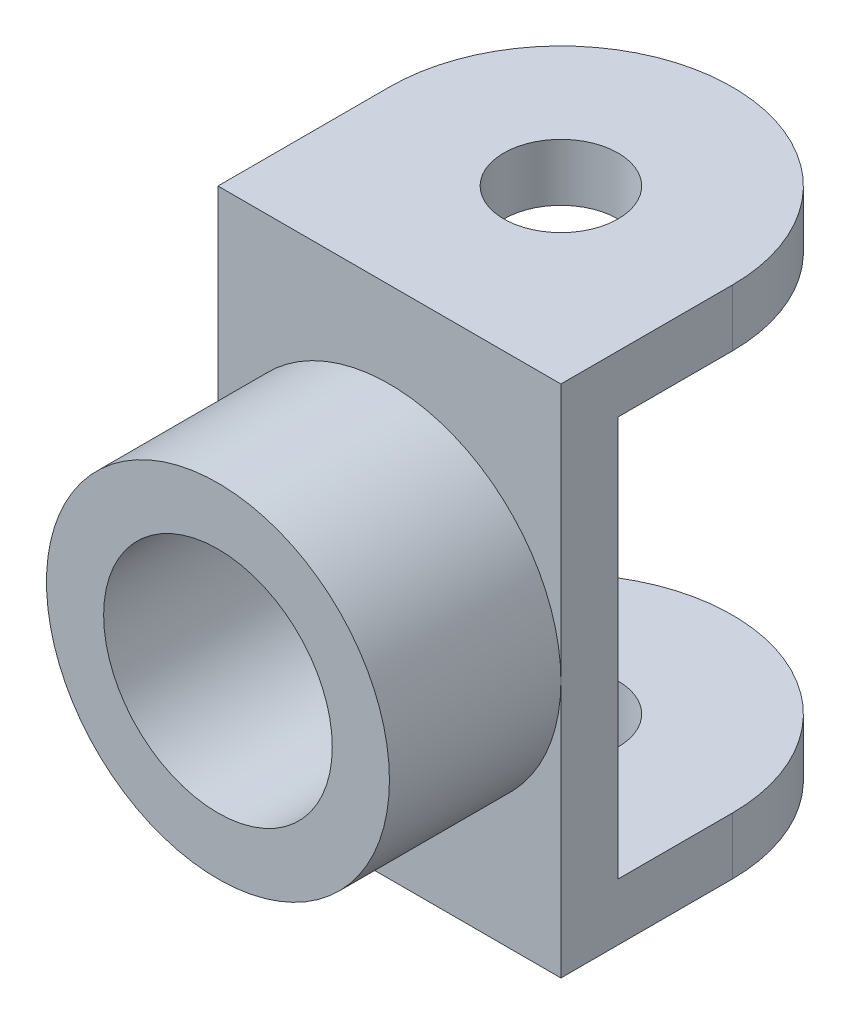
ISO-10303-21;
HEADER;
FILE_DESCRIPTION(('STEP AP214'),'2;1');
FILE_NAME('part.step','',(''),(''),'','','');
FILE_SCHEMA(('AUTOMOTIVE_DESIGN { 1 0 10303 214 1 1 1 1 }'));
ENDSEC;
DATA;
#1=APPLICATION_CONTEXT('core data for automotive mechanical design processes');
#2=APPLICATION_PROTOCOL_DEFINITION('international standard','automotive_design',2000,#1);
#3=PRODUCT_CONTEXT('',#1,'mechanical');
#4=PRODUCT('Part','Part','',(#3));
#5=PRODUCT_RELATED_PRODUCT_CATEGORY('part','',(#4));
#6=PRODUCT_DEFINITION_FORMATION('','',#4);
#7=PRODUCT_DEFINITION_CONTEXT('part definition',#1,'design');
#8=PRODUCT_DEFINITION('design','',#6,#7);
#9=PRODUCT_DEFINITION_SHAPE('','',#8);
#10=(LENGTH_UNIT() NAMED_UNIT(*) SI_UNIT(.MILLI.,.METRE.));
#11=(NAMED_UNIT(*) PLANE_ANGLE_UNIT() SI_UNIT($,.RADIAN.));
#12=(NAMED_UNIT(*) SI_UNIT($,.STERADIAN.) SOLID_ANGLE_UNIT());
#13=UNCERTAINTY_MEASURE_WITH_UNIT(LENGTH_MEASURE(1.E-05),#10,'distance_accuracy_value','');
#14=(GEOMETRIC_REPRESENTATION_CONTEXT(3) GLOBAL_UNCERTAINTY_ASSIGNED_CONTEXT((#13)) GLOBAL_UNIT_ASSIGNED_CONTEXT((#10,
#11,#12)) REPRESENTATION_CONTEXT('',''));
#15=CARTESIAN_POINT('',(0.,0.,0.));
#16=DIRECTION('',(0.,0.,1.));
#17=DIRECTION('',(1.,0.,0.));
#18=AXIS2_PLACEMENT_3D('',#15,#16,#17);
#19=CARTESIAN_POINT('',(0.,90.,0.));
#20=DIRECTION('',(0.,0.,1.));
#21=DIRECTION('',(1.,0.,0.));
#22=AXIS2_PLACEMENT_3D('',#19,#20,#21);
#23=PLANE('',#22);
#24=CARTESIAN_POINT('',(30.,45.,0.));
#25=DIRECTION('',(0.,0.,1.));
#26=DIRECTION('',(1.,0.,0.));
#27=AXIS2_PLACEMENT_3D('',#24,#25,#26);
#28=CIRCLE('',#27,30.);
#29=CARTESIAN_POINT('',(60.,45.,0.));
#30=VERTEX_POINT('',#29);
#31=CARTESIAN_POINT('',(0.,45.,0.));
#32=VERTEX_POINT('',#31);
#33=EDGE_CURVE('E47',#30,#32,#28,.T.);
#34=ORIENTED_EDGE('',*,*,#33,.F.);
#35=DIRECTION('',(0.,-1.,0.));
#36=VECTOR('',#35,1.);
#37=CARTESIAN_POINT('',(60.,90.,0.));
#38=LINE('',#37,#36);
#39=CARTESIAN_POINT('',(60.,90.,0.));
#40=VERTEX_POINT('',#39);
#41=EDGE_CURVE('E108',#40,#30,#38,.T.);
#42=ORIENTED_EDGE('',*,*,#41,.F.);
#43=DIRECTION('',(-1.,0.,0.));
#44=VECTOR('',#43,1.);
#45=CARTESIAN_POINT('',(0.,90.,0.));
#46=LINE('',#45,#44);
#47=CARTESIAN_POINT('',(0.,90.,0.));
#48=VERTEX_POINT('',#47);
#49=EDGE_CURVE('E205',#40,#48,#46,.T.);
#50=ORIENTED_EDGE('',*,*,#49,.T.);
#51=DIRECTION('',(0.,-1.,0.));
#52=VECTOR('',#51,1.);
#53=CARTESIAN_POINT('',(0.,90.,0.));
#54=LINE('',#53,#52);
#55=EDGE_CURVE('E129',#48,#32,#54,.T.);
#56=ORIENTED_EDGE('',*,*,#55,.T.);
#57=EDGE_LOOP('',(#34,#42,#50,#56));
#58=FACE_BOUND('',#57,.T.);
#59=ADVANCED_FACE('F37',(#58),#23,.T.);
#60=CARTESIAN_POINT('',(30.,90.,-30.));
#61=DIRECTION('',(0.,-1.,0.));
#62=DIRECTION('',(0.,0.,-1.));
#63=AXIS2_PLACEMENT_3D('',#60,#61,#62);
#64=CYLINDRICAL_SURFACE('',#63,30.);
#65=DIRECTION('',(0.,-1.,0.));
#66=VECTOR('',#65,1.);
#67=CARTESIAN_POINT('',(60.,90.,-30.));
#68=LINE('',#67,#66);
#69=CARTESIAN_POINT('',(60.,90.,-30.));
#70=VERTEX_POINT('',#69);
#71=CARTESIAN_POINT('',(60.,80.,-30.));
#72=VERTEX_POINT('',#71);
#73=EDGE_CURVE('E126',#70,#72,#68,.T.);
#74=ORIENTED_EDGE('',*,*,#73,.T.);
#75=CARTESIAN_POINT('',(30.,80.,-30.));
#76=DIRECTION('',(0.,1.,0.));
#77=DIRECTION('',(0.,0.,1.));
#78=AXIS2_PLACEMENT_3D('',#75,#76,#77);
#79=CIRCLE('',#78,30.);
#80=CARTESIAN_POINT('',(0.,80.,-30.));
#81=VERTEX_POINT('',#80);
#82=EDGE_CURVE('E188',#72,#81,#79,.T.);
#83=ORIENTED_EDGE('',*,*,#82,.T.);
#84=DIRECTION('',(0.,-1.,0.));
#85=VECTOR('',#84,1.);
#86=CARTESIAN_POINT('',(0.,90.,-30.));
#87=LINE('',#86,#85);
#88=CARTESIAN_POINT('',(0.,90.,-30.));
#89=VERTEX_POINT('',#88);
#90=EDGE_CURVE('E184',#89,#81,#87,.T.);
#91=ORIENTED_EDGE('',*,*,#90,.F.);
#92=CARTESIAN_POINT('',(30.,90.,-30.));
#93=DIRECTION('',(0.,1.,0.));
#94=DIRECTION('',(0.,0.,1.));
#95=AXIS2_PLACEMENT_3D('',#92,#93,#94);
#96=CIRCLE('',#95,30.);
#97=EDGE_CURVE('E200',#70,#89,#96,.T.);
#98=ORIENTED_EDGE('',*,*,#97,.F.);
#99=EDGE_LOOP('',(#74,#83,#91,#98));
#100=FACE_BOUND('',#99,.T.);
#101=ADVANCED_FACE('F152',(#100),#64,.T.);
#102=CARTESIAN_POINT('',(30.,90.,-30.));
#103=DIRECTION('',(0.,-1.,0.));
#104=DIRECTION('',(0.,0.,-1.));
#105=AXIS2_PLACEMENT_3D('',#102,#103,#104);
#106=CYLINDRICAL_SURFACE('',#105,10.);
#107=CARTESIAN_POINT('',(30.,80.,-30.));
#108=DIRECTION('',(0.,1.,0.));
#109=DIRECTION('',(0.,0.,1.));
#110=AXIS2_PLACEMENT_3D('',#107,#108,#109);
#111=CIRCLE('',#110,10.);
#112=CARTESIAN_POINT('',(30.,80.,-40.));
#113=VERTEX_POINT('',#112);
#114=EDGE_CURVE('E187',#113,#113,#111,.T.);
#115=CARTESIAN_POINT('',(30.,90.,-30.));
#116=DIRECTION('',(0.,1.,0.));
#117=DIRECTION('',(0.,0.,1.));
#118=AXIS2_PLACEMENT_3D('',#115,#116,#117);
#119=CIRCLE('',#118,10.);
#120=CARTESIAN_POINT('',(30.,90.,-40.));
#121=VERTEX_POINT('',#120);
#122=EDGE_CURVE('E197',#121,#121,#119,.T.);
#123=CARTESIAN_POINT('',(30.,80.,-40.));
#124=CARTESIAN_POINT('',(30.,80.1041666666667,-40.));
#125=CARTESIAN_POINT('',(30.,80.2083333333333,-40.));
#126=CARTESIAN_POINT('',(30.,80.4166666666667,-40.));
#127=CARTESIAN_POINT('',(30.,80.5208333333333,-40.));
#128=CARTESIAN_POINT('',(30.,80.7291666666667,-40.));
#129=CARTESIAN_POINT('',(30.,80.8333333333333,-40.));
#130=CARTESIAN_POINT('',(30.,81.0416666666667,-40.));
#131=CARTESIAN_POINT('',(30.,81.1458333333333,-40.));
#132=CARTESIAN_POINT('',(30.,81.3541666666667,-40.));
#133=CARTESIAN_POINT('',(30.,81.4583333333333,-40.));
#134=CARTESIAN_POINT('',(30.,81.6666666666667,-40.));
#135=CARTESIAN_POINT('',(30.,81.7708333333333,-40.));
#136=CARTESIAN_POINT('',(30.,81.9791666666667,-40.));
#137=CARTESIAN_POINT('',(30.,82.0833333333333,-40.));
#138=CARTESIAN_POINT('',(30.,82.2916666666667,-40.));
#139=CARTESIAN_POINT('',(30.,82.3958333333333,-40.));
#140=CARTESIAN_POINT('',(30.,82.6041666666667,-40.));
#141=CARTESIAN_POINT('',(30.,82.7083333333333,-40.));
#142=CARTESIAN_POINT('',(30.,82.9166666666667,-40.));
#143=CARTESIAN_POINT('',(30.,83.0208333333333,-40.));
#144=CARTESIAN_POINT('',(30.,83.2291666666667,-40.));
#145=CARTESIAN_POINT('',(30.,83.3333333333333,-40.));
#146=CARTESIAN_POINT('',(30.,83.5416666666667,-40.));
#147=CARTESIAN_POINT('',(30.,83.6458333333333,-40.));
#148=CARTESIAN_POINT('',(30.,83.8541666666667,-40.));
#149=CARTESIAN_POINT('',(30.,83.9583333333333,-40.));
#150=CARTESIAN_POINT('',(30.,84.1666666666667,-40.));
#151=CARTESIAN_POINT('',(30.,84.2708333333333,-40.));
#152=CARTESIAN_POINT('',(30.,84.4791666666667,-40.));
#153=CARTESIAN_POINT('',(30.,84.5833333333333,-40.));
#154=CARTESIAN_POINT('',(30.,84.7916666666667,-40.));
#155=CARTESIAN_POINT('',(30.,84.8958333333333,-40.));
#156=CARTESIAN_POINT('',(30.,85.1041666666667,-40.));
#157=CARTESIAN_POINT('',(30.,85.2083333333333,-40.));
#158=CARTESIAN_POINT('',(30.,85.4166666666667,-40.));
#159=CARTESIAN_POINT('',(30.,85.5208333333333,-40.));
#160=CARTESIAN_POINT('',(30.,85.7291666666667,-40.));
#161=CARTESIAN_POINT('',(30.,85.8333333333333,-40.));
#162=CARTESIAN_POINT('',(30.,86.0416666666667,-40.));
#163=CARTESIAN_POINT('',(30.,86.1458333333333,-40.));
#164=CARTESIAN_POINT('',(30.,86.3541666666667,-40.));
#165=CARTESIAN_POINT('',(30.,86.4583333333333,-40.));
#166=CARTESIAN_POINT('',(30.,86.6666666666667,-40.));
#167=CARTESIAN_POINT('',(30.,86.7708333333333,-40.));
#168=CARTESIAN_POINT('',(30.,86.9791666666667,-40.));
#169=CARTESIAN_POINT('',(30.,87.0833333333333,-40.));
#170=CARTESIAN_POINT('',(30.,87.2916666666667,-40.));
#171=CARTESIAN_POINT('',(30.,87.3958333333333,-40.));
#172=CARTESIAN_POINT('',(30.,87.6041666666667,-40.));
#173=CARTESIAN_POINT('',(30.,87.7083333333333,-40.));
#174=CARTESIAN_POINT('',(30.,87.9166666666667,-40.));
#175=CARTESIAN_POINT('',(30.,88.0208333333333,-40.));
#176=CARTESIAN_POINT('',(30.,88.2291666666667,-40.));
#177=CARTESIAN_POINT('',(30.,88.3333333333333,-40.));
#178=CARTESIAN_POINT('',(30.,88.5416666666667,-40.));
#179=CARTESIAN_POINT('',(30.,88.6458333333333,-40.));
#180=CARTESIAN_POINT('',(30.,88.8541666666667,-40.));
#181=CARTESIAN_POINT('',(30.,88.9583333333333,-40.));
#182=CARTESIAN_POINT('',(30.,89.1666666666667,-40.));
#183=CARTESIAN_POINT('',(30.,89.2708333333333,-40.));
#184=CARTESIAN_POINT('',(30.,89.4791666666667,-40.));
#185=CARTESIAN_POINT('',(30.,89.5833333333333,-40.));
#186=CARTESIAN_POINT('',(30.,89.7916666666667,-40.));
#187=CARTESIAN_POINT('',(30.,89.8958333333333,-40.));
#188=CARTESIAN_POINT('',(30.,90.,-40.));
#189=B_SPLINE_CURVE_WITH_KNOTS('',3,(#123,#124,#125,#126,#127,#128,#129,#130,#131,#132,#133,
#134,#135,#136,#137,#138,#139,#140,#141,#142,#143,#144,#145,#146,#147,#148,#149,#150,#151,#152,
#153,#154,#155,#156,#157,#158,#159,#160,#161,#162,#163,#164,#165,#166,#167,#168,#169,#170,#171,
#172,#173,#174,#175,#176,#177,#178,#179,#180,#181,#182,#183,#184,#185,#186,#187,#188),
.UNSPECIFIED.,.F.,.F.,(4,2,2,2,2,2,2,2,2,2,2,2,2,2,2,2,2,2,2,2,2,2,2,2,2,2,2,2,2,2,2,2,4),(0.,
0.312499999999993,0.625000000000001,0.937499999999994,1.24999999999999,1.56249999999999,
1.87499999999999,2.1875,2.49999999999999,2.8125,3.12499999999999,3.4375,3.74999999999999,4.0625,
4.37499999999999,4.6875,4.99999999999999,5.3125,5.62499999999999,5.93749999999998,
6.24999999999999,6.56249999999998,6.87499999999999,7.18749999999999,7.49999999999999,
7.81249999999999,8.12499999999999,8.43749999999999,8.74999999999999,9.06249999999999,
9.37499999999999,9.68749999999999,9.99999999999999),.UNSPECIFIED.);
#190=EDGE_CURVE('BSEAM157',#113,#121,#189,.T.);
#191=ORIENTED_EDGE('',*,*,#114,.F.);
#192=ORIENTED_EDGE('',*,*,#122,.T.);
#193=ORIENTED_EDGE('',*,*,#190,.T.);
#194=ORIENTED_EDGE('',*,*,#190,.F.);
#195=EDGE_LOOP('',(#191,#193,#192,#194));
#196=FACE_BOUND('',#195,.T.);
#197=ADVANCED_FACE('F157',(#196),#106,.F.);
#198=CARTESIAN_POINT('',(0.,9.99999999999999,-30.));
#199=VERTEX_POINT('',#198);
#200=CARTESIAN_POINT('',(0.,0.,-30.));
#201=VERTEX_POINT('',#200);
#202=EDGE_CURVE('E222',#199,#201,#87,.T.);
#203=ORIENTED_EDGE('',*,*,#202,.F.);
#204=CARTESIAN_POINT('',(30.,9.99999999999999,-30.));
#205=DIRECTION('',(0.,-1.,0.));
#206=DIRECTION('',(0.,0.,-1.));
#207=AXIS2_PLACEMENT_3D('',#204,#205,#206);
#208=CIRCLE('',#207,30.);
#209=CARTESIAN_POINT('',(60.,9.99999999999999,-30.));
#210=VERTEX_POINT('',#209);
#211=EDGE_CURVE('E238',#199,#210,#208,.T.);
#212=ORIENTED_EDGE('',*,*,#211,.T.);
#213=CARTESIAN_POINT('',(60.,0.,-30.));
#214=VERTEX_POINT('',#213);
#215=EDGE_CURVE('E208',#210,#214,#68,.T.);
#216=ORIENTED_EDGE('',*,*,#215,.T.);
#217=CARTESIAN_POINT('',(30.,0.,-30.));
#218=DIRECTION('',(0.,1.,0.));
#219=DIRECTION('',(0.,0.,1.));
#220=AXIS2_PLACEMENT_3D('',#217,#218,#219);
#221=CIRCLE('',#220,30.);
#222=EDGE_CURVE('E211',#214,#201,#221,.T.);
#223=ORIENTED_EDGE('',*,*,#222,.T.);
#224=EDGE_LOOP('',(#203,#212,#216,#223));
#225=FACE_BOUND('',#224,.T.);
#226=ADVANCED_FACE('F159',(#225),#64,.T.);
#227=CARTESIAN_POINT('',(0.,90.,0.));
#228=DIRECTION('',(-1.,0.,0.));
#229=DIRECTION('',(0.,0.,1.));
#230=AXIS2_PLACEMENT_3D('',#227,#228,#229);
#231=PLANE('',#230);
#232=DIRECTION('',(0.,0.,-1.));
#233=VECTOR('',#232,1.);
#234=CARTESIAN_POINT('',(0.,80.,0.));
#235=LINE('',#234,#233);
#236=CARTESIAN_POINT('',(0.,80.,-10.));
#237=VERTEX_POINT('',#236);
#238=EDGE_CURVE('E179',#237,#81,#235,.T.);
#239=ORIENTED_EDGE('',*,*,#238,.F.);
#240=DIRECTION('',(0.,1.,0.));
#241=VECTOR('',#240,1.);
#242=CARTESIAN_POINT('',(0.,90.,-10.));
#243=LINE('',#242,#241);
#244=CARTESIAN_POINT('',(0.,9.99999999999999,-10.));
#245=VERTEX_POINT('',#244);
#246=EDGE_CURVE('E181',#245,#237,#243,.T.);
#247=ORIENTED_EDGE('',*,*,#246,.F.);
#248=DIRECTION('',(0.,0.,1.));
#249=VECTOR('',#248,1.);
#250=CARTESIAN_POINT('',(0.,9.99999999999999,0.));
#251=LINE('',#250,#249);
#252=EDGE_CURVE('E236',#199,#245,#251,.T.);
#253=ORIENTED_EDGE('',*,*,#252,.F.);
#254=ORIENTED_EDGE('',*,*,#202,.T.);
#255=DIRECTION('',(0.,0.,-1.));
#256=VECTOR('',#255,1.);
#257=CARTESIAN_POINT('',(0.,0.,0.));
#258=LINE('',#257,#256);
#259=CARTESIAN_POINT('',(0.,0.,0.));
#260=VERTEX_POINT('',#259);
#261=EDGE_CURVE('E214',#260,#201,#258,.T.);
#262=ORIENTED_EDGE('',*,*,#261,.F.);
#263=EDGE_CURVE('E120',#32,#260,#54,.T.);
#264=ORIENTED_EDGE('',*,*,#263,.F.);
#265=ORIENTED_EDGE('',*,*,#55,.F.);
#266=DIRECTION('',(0.,0.,-1.));
#267=VECTOR('',#266,1.);
#268=CARTESIAN_POINT('',(0.,90.,0.));
#269=LINE('',#268,#267);
#270=EDGE_CURVE('E203',#48,#89,#269,.T.);
#271=ORIENTED_EDGE('',*,*,#270,.T.);
#272=ORIENTED_EDGE('',*,*,#90,.T.);
#273=EDGE_LOOP('',(#239,#247,#253,#254,#262,#264,#265,#271,#272));
#274=FACE_BOUND('',#273,.T.);
#275=ADVANCED_FACE('F165',(#274),#231,.T.);
#276=EDGE_CURVE('E11',#32,#30,#28,.T.);
#277=ORIENTED_EDGE('',*,*,#276,.F.);
#278=ORIENTED_EDGE('',*,*,#263,.T.);
#279=DIRECTION('',(-1.,0.,0.));
#280=VECTOR('',#279,1.);
#281=CARTESIAN_POINT('',(0.,0.,0.));
#282=LINE('',#281,#280);
#283=CARTESIAN_POINT('',(60.,0.,0.));
#284=VERTEX_POINT('',#283);
#285=EDGE_CURVE('E124',#284,#260,#282,.T.);
#286=ORIENTED_EDGE('',*,*,#285,.F.);
#287=EDGE_CURVE('E112',#30,#284,#38,.T.);
#288=ORIENTED_EDGE('',*,*,#287,.F.);
#289=EDGE_LOOP('',(#277,#278,#286,#288));
#290=FACE_BOUND('',#289,.T.);
#291=ADVANCED_FACE('F122',(#290),#23,.T.);
#292=CARTESIAN_POINT('',(30.,9.99999999999999,-30.));
#293=DIRECTION('',(0.,-1.,0.));
#294=DIRECTION('',(0.,0.,-1.));
#295=AXIS2_PLACEMENT_3D('',#292,#293,#294);
#296=CIRCLE('',#295,10.);
#297=CARTESIAN_POINT('',(30.,9.99999999999999,-40.));
#298=VERTEX_POINT('',#297);
#299=EDGE_CURVE('E193',#298,#298,#296,.T.);
#300=CARTESIAN_POINT('',(30.,0.,-30.));
#301=DIRECTION('',(0.,1.,0.));
#302=DIRECTION('',(0.,0.,1.));
#303=AXIS2_PLACEMENT_3D('',#300,#301,#302);
#304=CIRCLE('',#303,10.);
#305=CARTESIAN_POINT('',(30.,0.,-40.));
#306=VERTEX_POINT('',#305);
#307=EDGE_CURVE('E191',#306,#306,#304,.T.);
#308=CARTESIAN_POINT('',(30.,9.99999999999999,-40.));
#309=CARTESIAN_POINT('',(30.,9.89583333333333,-40.));
#310=CARTESIAN_POINT('',(30.,9.79166666666667,-40.));
#311=CARTESIAN_POINT('',(30.,9.58333333333333,-40.));
#312=CARTESIAN_POINT('',(30.,9.47916666666666,-40.));
#313=CARTESIAN_POINT('',(30.,9.27083333333333,-40.));
#314=CARTESIAN_POINT('',(30.,9.16666666666666,-40.));
#315=CARTESIAN_POINT('',(30.,8.95833333333332,-40.));
#316=CARTESIAN_POINT('',(30.,8.85416666666666,-40.));
#317=CARTESIAN_POINT('',(30.,8.64583333333333,-40.));
#318=CARTESIAN_POINT('',(30.,8.54166666666666,-40.));
#319=CARTESIAN_POINT('',(30.,8.33333333333333,-40.));
#320=CARTESIAN_POINT('',(30.,8.22916666666666,-40.));
#321=CARTESIAN_POINT('',(30.,8.02083333333333,-40.));
#322=CARTESIAN_POINT('',(30.,7.91666666666666,-40.));
#323=CARTESIAN_POINT('',(30.,7.70833333333332,-40.));
#324=CARTESIAN_POINT('',(30.,7.60416666666666,-40.));
#325=CARTESIAN_POINT('',(30.,7.39583333333333,-40.));
#326=CARTESIAN_POINT('',(30.,7.29166666666666,-40.));
#327=CARTESIAN_POINT('',(30.,7.08333333333333,-40.));
#328=CARTESIAN_POINT('',(30.,6.97916666666666,-40.));
#329=CARTESIAN_POINT('',(30.,6.77083333333332,-40.));
#330=CARTESIAN_POINT('',(30.,6.66666666666665,-40.));
#331=CARTESIAN_POINT('',(30.,6.45833333333332,-40.));
#332=CARTESIAN_POINT('',(30.,6.35416666666666,-40.));
#333=CARTESIAN_POINT('',(30.,6.14583333333333,-40.));
#334=CARTESIAN_POINT('',(30.,6.04166666666666,-40.));
#335=CARTESIAN_POINT('',(30.,5.83333333333333,-40.));
#336=CARTESIAN_POINT('',(30.,5.72916666666666,-40.));
#337=CARTESIAN_POINT('',(30.,5.52083333333332,-40.));
#338=CARTESIAN_POINT('',(30.,5.41666666666665,-40.));
#339=CARTESIAN_POINT('',(30.,5.20833333333332,-40.));
#340=CARTESIAN_POINT('',(30.,5.10416666666666,-40.));
#341=CARTESIAN_POINT('',(30.,4.89583333333333,-40.));
#342=CARTESIAN_POINT('',(30.,4.79166666666666,-40.));
#343=CARTESIAN_POINT('',(30.,4.58333333333333,-40.));
#344=CARTESIAN_POINT('',(30.,4.47916666666666,-40.));
#345=CARTESIAN_POINT('',(30.,4.27083333333332,-40.));
#346=CARTESIAN_POINT('',(30.,4.16666666666665,-40.));
#347=CARTESIAN_POINT('',(30.,3.95833333333332,-40.));
#348=CARTESIAN_POINT('',(30.,3.85416666666665,-40.));
#349=CARTESIAN_POINT('',(30.,3.64583333333333,-40.));
#350=CARTESIAN_POINT('',(30.,3.54166666666666,-40.));
#351=CARTESIAN_POINT('',(30.,3.33333333333333,-40.));
#352=CARTESIAN_POINT('',(30.,3.22916666666666,-40.));
#353=CARTESIAN_POINT('',(30.,3.02083333333332,-40.));
#354=CARTESIAN_POINT('',(30.,2.91666666666665,-40.));
#355=CARTESIAN_POINT('',(30.,2.70833333333332,-40.));
#356=CARTESIAN_POINT('',(30.,2.60416666666665,-40.));
#357=CARTESIAN_POINT('',(30.,2.39583333333332,-40.));
#358=CARTESIAN_POINT('',(30.,2.29166666666666,-40.));
#359=CARTESIAN_POINT('',(30.,2.08333333333333,-40.));
#360=CARTESIAN_POINT('',(30.,1.97916666666666,-40.));
#361=CARTESIAN_POINT('',(30.,1.77083333333332,-40.));
#362=CARTESIAN_POINT('',(30.,1.66666666666665,-40.));
#363=CARTESIAN_POINT('',(30.,1.45833333333332,-40.));
#364=CARTESIAN_POINT('',(30.,1.35416666666665,-40.));
#365=CARTESIAN_POINT('',(30.,1.14583333333332,-40.));
#366=CARTESIAN_POINT('',(30.,1.04166666666666,-40.));
#367=CARTESIAN_POINT('',(30.,0.833333333333325,-40.));
#368=CARTESIAN_POINT('',(30.,0.729166666666656,-40.));
#369=CARTESIAN_POINT('',(30.,0.520833333333318,-40.));
#370=CARTESIAN_POINT('',(30.,0.416666666666649,-40.));
#371=CARTESIAN_POINT('',(30.,0.208333333333315,-40.));
#372=CARTESIAN_POINT('',(30.,0.10416666666665,-40.));
#373=CARTESIAN_POINT('',(30.,0.,-40.));
#374=B_SPLINE_CURVE_WITH_KNOTS('',3,(#308,#309,#310,#311,#312,#313,#314,#315,#316,#317,#318,
#319,#320,#321,#322,#323,#324,#325,#326,#327,#328,#329,#330,#331,#332,#333,#334,#335,#336,#337,
#338,#339,#340,#341,#342,#343,#344,#345,#346,#347,#348,#349,#350,#351,#352,#353,#354,#355,#356,
#357,#358,#359,#360,#361,#362,#363,#364,#365,#366,#367,#368,#369,#370,#371,#372,#373),
.UNSPECIFIED.,.F.,.F.,(4,2,2,2,2,2,2,2,2,2,2,2,2,2,2,2,2,2,2,2,2,2,2,2,2,2,2,2,2,2,2,2,4),(0.,
0.312499999999993,0.625000000000001,0.937500000000008,1.25,1.56249999999999,1.875,
2.18750000000001,2.5,2.8125,3.125,3.43750000000001,3.75,4.0625,4.375,4.68750000000001,5.,5.3125,
5.62500000000001,5.93750000000001,6.25000000000001,6.5625,6.87500000000001,7.18750000000001,
7.50000000000001,7.8125,8.12500000000001,8.43750000000001,8.75000000000001,9.0625,
9.37500000000001,9.68750000000002,10.),.UNSPECIFIED.);
#375=EDGE_CURVE('BSEAM39',#298,#306,#374,.T.);
#376=ORIENTED_EDGE('',*,*,#299,.F.);
#377=ORIENTED_EDGE('',*,*,#307,.F.);
#378=ORIENTED_EDGE('',*,*,#375,.T.);
#379=ORIENTED_EDGE('',*,*,#375,.F.);
#380=EDGE_LOOP('',(#376,#378,#377,#379));
#381=FACE_BOUND('',#380,.T.);
#382=ADVANCED_FACE('F39',(#381),#106,.F.);
#383=CARTESIAN_POINT('',(60.,90.,0.));
#384=DIRECTION('',(1.,0.,0.));
#385=DIRECTION('',(0.,0.,-1.));
#386=AXIS2_PLACEMENT_3D('',#383,#384,#385);
#387=PLANE('',#386);
#388=DIRECTION('',(0.,0.,1.));
#389=VECTOR('',#388,1.);
#390=CARTESIAN_POINT('',(60.,80.,0.));
#391=LINE('',#390,#389);
#392=CARTESIAN_POINT('',(60.,80.,-10.));
#393=VERTEX_POINT('',#392);
#394=EDGE_CURVE('E41',#72,#393,#391,.T.);
#395=ORIENTED_EDGE('',*,*,#394,.F.);
#396=ORIENTED_EDGE('',*,*,#73,.F.);
#397=DIRECTION('',(0.,0.,1.));
#398=VECTOR('',#397,1.);
#399=CARTESIAN_POINT('',(60.,90.,0.));
#400=LINE('',#399,#398);
#401=EDGE_CURVE('E115',#70,#40,#400,.T.);
#402=ORIENTED_EDGE('',*,*,#401,.T.);
#403=ORIENTED_EDGE('',*,*,#41,.T.);
#404=ORIENTED_EDGE('',*,*,#287,.T.);
#405=DIRECTION('',(0.,0.,1.));
#406=VECTOR('',#405,1.);
#407=CARTESIAN_POINT('',(60.,0.,0.));
#408=LINE('',#407,#406);
#409=EDGE_CURVE('E201',#214,#284,#408,.T.);
#410=ORIENTED_EDGE('',*,*,#409,.F.);
#411=ORIENTED_EDGE('',*,*,#215,.F.);
#412=DIRECTION('',(0.,0.,-1.));
#413=VECTOR('',#412,1.);
#414=CARTESIAN_POINT('',(60.,9.99999999999999,0.));
#415=LINE('',#414,#413);
#416=CARTESIAN_POINT('',(60.,9.99999999999999,-10.));
#417=VERTEX_POINT('',#416);
#418=EDGE_CURVE('E225',#417,#210,#415,.T.);
#419=ORIENTED_EDGE('',*,*,#418,.F.);
#420=DIRECTION('',(0.,-1.,0.));
#421=VECTOR('',#420,1.);
#422=CARTESIAN_POINT('',(60.,90.,-10.));
#423=LINE('',#422,#421);
#424=EDGE_CURVE('E224',#393,#417,#423,.T.);
#425=ORIENTED_EDGE('',*,*,#424,.F.);
#426=EDGE_LOOP('',(#395,#396,#402,#403,#404,#410,#411,#419,#425));
#427=FACE_BOUND('',#426,.T.);
#428=ADVANCED_FACE('F110',(#427),#387,.T.);
#429=CARTESIAN_POINT('',(0.,90.,0.));
#430=DIRECTION('',(0.,1.,0.));
#431=DIRECTION('',(0.,0.,1.));
#432=AXIS2_PLACEMENT_3D('',#429,#430,#431);
#433=PLANE('',#432);
#434=ORIENTED_EDGE('',*,*,#122,.F.);
#435=EDGE_LOOP('',(#434));
#436=FACE_BOUND('',#435,.T.);
#437=ORIENTED_EDGE('',*,*,#97,.T.);
#438=ORIENTED_EDGE('',*,*,#270,.F.);
#439=ORIENTED_EDGE('',*,*,#49,.F.);
#440=ORIENTED_EDGE('',*,*,#401,.F.);
#441=EDGE_LOOP('',(#437,#438,#439,#440));
#442=FACE_BOUND('',#441,.T.);
#443=ADVANCED_FACE('F253',(#436,#442),#433,.T.);
#444=CARTESIAN_POINT('',(0.,0.,0.));
#445=DIRECTION('',(0.,1.,0.));
#446=DIRECTION('',(0.,0.,1.));
#447=AXIS2_PLACEMENT_3D('',#444,#445,#446);
#448=PLANE('',#447);
#449=ORIENTED_EDGE('',*,*,#307,.T.);
#450=EDGE_LOOP('',(#449));
#451=FACE_BOUND('',#450,.T.);
#452=ORIENTED_EDGE('',*,*,#222,.F.);
#453=ORIENTED_EDGE('',*,*,#409,.T.);
#454=ORIENTED_EDGE('',*,*,#285,.T.);
#455=ORIENTED_EDGE('',*,*,#261,.T.);
#456=EDGE_LOOP('',(#452,#453,#454,#455));
#457=FACE_BOUND('',#456,.T.);
#458=ADVANCED_FACE('F250',(#451,#457),#448,.F.);
#459=CARTESIAN_POINT('',(-18.,80.,-10.));
#460=DIRECTION('',(0.,1.,0.));
#461=DIRECTION('',(0.,0.,1.));
#462=AXIS2_PLACEMENT_3D('',#459,#460,#461);
#463=PLANE('',#462);
#464=ORIENTED_EDGE('',*,*,#114,.T.);
#465=EDGE_LOOP('',(#464));
#466=FACE_BOUND('',#465,.T.);
#467=ORIENTED_EDGE('',*,*,#238,.T.);
#468=ORIENTED_EDGE('',*,*,#82,.F.);
#469=ORIENTED_EDGE('',*,*,#394,.T.);
#470=DIRECTION('',(1.,0.,0.));
#471=VECTOR('',#470,1.);
#472=CARTESIAN_POINT('',(-18.,80.,-10.));
#473=LINE('',#472,#471);
#474=EDGE_CURVE('E60',#237,#393,#473,.T.);
#475=ORIENTED_EDGE('',*,*,#474,.F.);
#476=EDGE_LOOP('',(#467,#468,#469,#475));
#477=FACE_BOUND('',#476,.T.);
#478=ADVANCED_FACE('F231',(#466,#477),#463,.F.);
#479=CARTESIAN_POINT('',(-18.,9.99999999999999,-10.));
#480=DIRECTION('',(0.,-1.,0.));
#481=DIRECTION('',(0.,0.,-1.));
#482=AXIS2_PLACEMENT_3D('',#479,#480,#481);
#483=PLANE('',#482);
#484=ORIENTED_EDGE('',*,*,#299,.T.);
#485=EDGE_LOOP('',(#484));
#486=FACE_BOUND('',#485,.T.);
#487=ORIENTED_EDGE('',*,*,#252,.T.);
#488=DIRECTION('',(1.,0.,0.));
#489=VECTOR('',#488,1.);
#490=CARTESIAN_POINT('',(-18.,9.99999999999999,-10.));
#491=LINE('',#490,#489);
#492=EDGE_CURVE('E234',#245,#417,#491,.T.);
#493=ORIENTED_EDGE('',*,*,#492,.T.);
#494=ORIENTED_EDGE('',*,*,#418,.T.);
#495=ORIENTED_EDGE('',*,*,#211,.F.);
#496=EDGE_LOOP('',(#487,#493,#494,#495));
#497=FACE_BOUND('',#496,.T.);
#498=ADVANCED_FACE('F235',(#486,#497),#483,.F.);
#499=CARTESIAN_POINT('',(-18.,80.,-10.));
#500=DIRECTION('',(0.,0.,1.));
#501=DIRECTION('',(0.,-1.,0.));
#502=AXIS2_PLACEMENT_3D('',#499,#500,#501);
#503=PLANE('',#502);
#504=ORIENTED_EDGE('',*,*,#246,.T.);
#505=ORIENTED_EDGE('',*,*,#474,.T.);
#506=ORIENTED_EDGE('',*,*,#424,.T.);
#507=ORIENTED_EDGE('',*,*,#492,.F.);
#508=EDGE_LOOP('',(#504,#505,#506,#507));
#509=FACE_BOUND('',#508,.T.);
#510=ADVANCED_FACE('F146',(#509),#503,.F.);
#511=CARTESIAN_POINT('',(30.,45.,30.));
#512=DIRECTION('',(0.,0.,1.));
#513=DIRECTION('',(1.,0.,0.));
#514=AXIS2_PLACEMENT_3D('',#511,#512,#513);
#515=PLANE('',#514);
#516=CARTESIAN_POINT('',(30.,45.,30.));
#517=DIRECTION('',(0.,0.,1.));
#518=DIRECTION('',(1.,0.,0.));
#519=AXIS2_PLACEMENT_3D('',#516,#517,#518);
#520=CIRCLE('',#519,30.);
#521=CARTESIAN_POINT('',(60.,45.,30.));
#522=VERTEX_POINT('',#521);
#523=EDGE_CURVE('E131',#522,#522,#520,.T.);
#524=ORIENTED_EDGE('',*,*,#523,.T.);
#525=EDGE_LOOP('',(#524));
#526=FACE_BOUND('',#525,.T.);
#527=CARTESIAN_POINT('',(30.,45.,30.));
#528=DIRECTION('',(0.,0.,1.));
#529=DIRECTION('',(1.,0.,0.));
#530=AXIS2_PLACEMENT_3D('',#527,#528,#529);
#531=CIRCLE('',#530,20.);
#532=CARTESIAN_POINT('',(50.,45.,30.));
#533=VERTEX_POINT('',#532);
#534=EDGE_CURVE('E132',#533,#533,#531,.T.);
#535=ORIENTED_EDGE('',*,*,#534,.F.);
#536=EDGE_LOOP('',(#535));
#537=FACE_BOUND('',#536,.T.);
#538=ADVANCED_FACE('F136',(#526,#537),#515,.T.);
#539=CARTESIAN_POINT('',(30.,45.,30.));
#540=DIRECTION('',(0.,0.,-1.));
#541=DIRECTION('',(-1.,0.,0.));
#542=AXIS2_PLACEMENT_3D('',#539,#540,#541);
#543=CYLINDRICAL_SURFACE('',#542,30.);
#544=ORIENTED_EDGE('',*,*,#523,.F.);
#545=EDGE_LOOP('',(#544));
#546=FACE_BOUND('',#545,.T.);
#547=ORIENTED_EDGE('',*,*,#33,.T.);
#548=ORIENTED_EDGE('',*,*,#276,.T.);
#549=EDGE_LOOP('',(#547,#548));
#550=FACE_BOUND('',#549,.T.);
#551=ADVANCED_FACE('F133',(#546,#550),#543,.T.);
#552=CARTESIAN_POINT('',(30.,45.,30.));
#553=DIRECTION('',(0.,0.,-1.));
#554=DIRECTION('',(-1.,0.,0.));
#555=AXIS2_PLACEMENT_3D('',#552,#553,#554);
#556=CYLINDRICAL_SURFACE('',#555,20.);
#557=ORIENTED_EDGE('',*,*,#534,.T.);
#558=EDGE_LOOP('',(#557));
#559=FACE_BOUND('',#558,.T.);
#560=CARTESIAN_POINT('',(30.,45.,0.));
#561=DIRECTION('',(0.,0.,1.));
#562=DIRECTION('',(1.,0.,0.));
#563=AXIS2_PLACEMENT_3D('',#560,#561,#562);
#564=CIRCLE('',#563,20.);
#565=CARTESIAN_POINT('',(50.,45.,0.));
#566=VERTEX_POINT('',#565);
#567=EDGE_CURVE('E412',#566,#566,#564,.T.);
#568=ORIENTED_EDGE('',*,*,#567,.F.);
#569=EDGE_LOOP('',(#568));
#570=FACE_BOUND('',#569,.T.);
#571=ADVANCED_FACE('F135',(#559,#570),#556,.F.);
#572=ORIENTED_EDGE('',*,*,#567,.T.);
#573=EDGE_LOOP('',(#572));
#574=FACE_BOUND('',#573,.T.);
#575=ADVANCED_FACE('F143',(#574),#23,.T.);
#576=CLOSED_SHELL('',(#59,#101,#197,#226,#275,#291,#382,#428,#443,#458,#478,#498,#510,#538,#551,
#571,#575));
#577=MANIFOLD_SOLID_BREP('B2',#576);
#578=ADVANCED_BREP_SHAPE_REPRESENTATION('',(#18,#577),#14);
#579=SHAPE_DEFINITION_REPRESENTATION(#9,#578);
ENDSEC;
END-ISO-10303-21;
